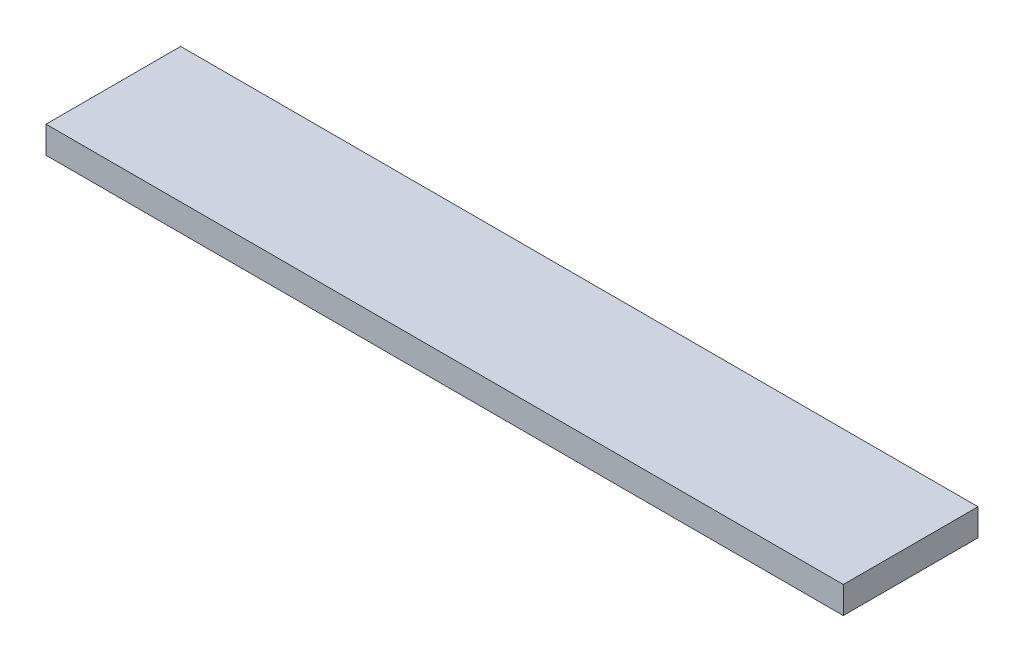
ISO-10303-21;
HEADER;
FILE_DESCRIPTION(('STEP AP214'),'2;1');
FILE_NAME('part.step','',(''),(''),'','','');
FILE_SCHEMA(('AUTOMOTIVE_DESIGN { 1 0 10303 214 1 1 1 1 }'));
ENDSEC;
DATA;
#1=APPLICATION_CONTEXT('core data for automotive mechanical design processes');
#2=APPLICATION_PROTOCOL_DEFINITION('international standard','automotive_design',2000,#1);
#3=PRODUCT_CONTEXT('',#1,'mechanical');
#4=PRODUCT('Part','Part','',(#3));
#5=PRODUCT_RELATED_PRODUCT_CATEGORY('part','',(#4));
#6=PRODUCT_DEFINITION_FORMATION('','',#4);
#7=PRODUCT_DEFINITION_CONTEXT('part definition',#1,'design');
#8=PRODUCT_DEFINITION('design','',#6,#7);
#9=PRODUCT_DEFINITION_SHAPE('','',#8);
#10=(LENGTH_UNIT() NAMED_UNIT(*) SI_UNIT(.MILLI.,.METRE.));
#11=(NAMED_UNIT(*) PLANE_ANGLE_UNIT() SI_UNIT($,.RADIAN.));
#12=(NAMED_UNIT(*) SI_UNIT($,.STERADIAN.) SOLID_ANGLE_UNIT());
#13=UNCERTAINTY_MEASURE_WITH_UNIT(LENGTH_MEASURE(1.E-05),#10,'distance_accuracy_value','');
#14=(GEOMETRIC_REPRESENTATION_CONTEXT(3) GLOBAL_UNCERTAINTY_ASSIGNED_CONTEXT((#13)) GLOBAL_UNIT_ASSIGNED_CONTEXT((#10,
#11,#12)) REPRESENTATION_CONTEXT('',''));
#15=CARTESIAN_POINT('',(0.,0.,0.));
#16=DIRECTION('',(0.,0.,1.));
#17=DIRECTION('',(1.,0.,0.));
#18=AXIS2_PLACEMENT_3D('',#15,#16,#17);
#19=CARTESIAN_POINT('',(148.,10.0000000000012,-25.));
#20=DIRECTION('',(-1.,0.,0.));
#21=DIRECTION('',(0.,0.,1.));
#22=AXIS2_PLACEMENT_3D('',#19,#20,#21);
#23=PLANE('',#22);
#24=DIRECTION('',(0.,0.,-1.));
#25=VECTOR('',#24,1.);
#26=CARTESIAN_POINT('',(148.,1.22124532708767E-12,-25.));
#27=LINE('',#26,#25);
#28=CARTESIAN_POINT('',(148.,1.22124532708767E-12,25.0000000000006));
#29=VERTEX_POINT('',#28);
#30=CARTESIAN_POINT('',(148.,1.22124532708767E-12,-25.));
#31=VERTEX_POINT('',#30);
#32=EDGE_CURVE('E93',#29,#31,#27,.T.);
#33=ORIENTED_EDGE('',*,*,#32,.T.);
#34=DIRECTION('',(0.,-1.,0.));
#35=VECTOR('',#34,1.);
#36=CARTESIAN_POINT('',(148.,10.0000000000012,-25.));
#37=LINE('',#36,#35);
#38=CARTESIAN_POINT('',(148.,10.0000000000012,-25.));
#39=VERTEX_POINT('',#38);
#40=EDGE_CURVE('E11',#39,#31,#37,.T.);
#41=ORIENTED_EDGE('',*,*,#40,.F.);
#42=DIRECTION('',(0.,0.,-1.));
#43=VECTOR('',#42,1.);
#44=CARTESIAN_POINT('',(148.,10.0000000000012,-25.));
#45=LINE('',#44,#43);
#46=CARTESIAN_POINT('',(148.,10.0000000000012,25.0000000000006));
#47=VERTEX_POINT('',#46);
#48=EDGE_CURVE('E81',#47,#39,#45,.T.);
#49=ORIENTED_EDGE('',*,*,#48,.F.);
#50=DIRECTION('',(0.,-1.,0.));
#51=VECTOR('',#50,1.);
#52=CARTESIAN_POINT('',(148.,10.0000000000012,25.0000000000006));
#53=LINE('',#52,#51);
#54=EDGE_CURVE('E89',#47,#29,#53,.T.);
#55=ORIENTED_EDGE('',*,*,#54,.T.);
#56=EDGE_LOOP('',(#33,#41,#49,#55));
#57=FACE_BOUND('',#56,.T.);
#58=ADVANCED_FACE('F30',(#57),#23,.F.);
#59=CARTESIAN_POINT('',(-148.,9.9999999999994,-25.));
#60=DIRECTION('',(0.,0.,1.));
#61=DIRECTION('',(1.,0.,0.));
#62=AXIS2_PLACEMENT_3D('',#59,#60,#61);
#63=PLANE('',#62);
#64=DIRECTION('',(-1.,0.,0.));
#65=VECTOR('',#64,1.);
#66=CARTESIAN_POINT('',(-148.,-6.10622663543836E-13,-25.));
#67=LINE('',#66,#65);
#68=CARTESIAN_POINT('',(-148.,-6.10622663543836E-13,-25.));
#69=VERTEX_POINT('',#68);
#70=EDGE_CURVE('E85',#31,#69,#67,.T.);
#71=ORIENTED_EDGE('',*,*,#70,.T.);
#72=DIRECTION('',(0.,-1.,0.));
#73=VECTOR('',#72,1.);
#74=CARTESIAN_POINT('',(-148.,9.9999999999994,-25.));
#75=LINE('',#74,#73);
#76=CARTESIAN_POINT('',(-148.,9.9999999999994,-25.));
#77=VERTEX_POINT('',#76);
#78=EDGE_CURVE('E38',#77,#69,#75,.T.);
#79=ORIENTED_EDGE('',*,*,#78,.F.);
#80=DIRECTION('',(-1.,0.,0.));
#81=VECTOR('',#80,1.);
#82=CARTESIAN_POINT('',(-148.,9.9999999999994,-25.));
#83=LINE('',#82,#81);
#84=EDGE_CURVE('E76',#39,#77,#83,.T.);
#85=ORIENTED_EDGE('',*,*,#84,.F.);
#86=ORIENTED_EDGE('',*,*,#40,.T.);
#87=EDGE_LOOP('',(#71,#79,#85,#86));
#88=FACE_BOUND('',#87,.T.);
#89=ADVANCED_FACE('F84',(#88),#63,.F.);
#90=CARTESIAN_POINT('',(-148.,9.9999999999994,-25.));
#91=DIRECTION('',(1.,0.,0.));
#92=DIRECTION('',(0.,0.,-1.));
#93=AXIS2_PLACEMENT_3D('',#90,#91,#92);
#94=PLANE('',#93);
#95=DIRECTION('',(0.,0.,1.));
#96=VECTOR('',#95,1.);
#97=CARTESIAN_POINT('',(-148.,-6.10622663543836E-13,-25.));
#98=LINE('',#97,#96);
#99=CARTESIAN_POINT('',(-148.,-6.10622663543836E-13,25.0000000000003));
#100=VERTEX_POINT('',#99);
#101=EDGE_CURVE('E63',#69,#100,#98,.T.);
#102=ORIENTED_EDGE('',*,*,#101,.T.);
#103=DIRECTION('',(0.,-1.,0.));
#104=VECTOR('',#103,1.);
#105=CARTESIAN_POINT('',(-148.,9.9999999999994,25.0000000000003));
#106=LINE('',#105,#104);
#107=CARTESIAN_POINT('',(-148.,9.9999999999994,25.0000000000003));
#108=VERTEX_POINT('',#107);
#109=EDGE_CURVE('E86',#108,#100,#106,.T.);
#110=ORIENTED_EDGE('',*,*,#109,.F.);
#111=DIRECTION('',(0.,0.,1.));
#112=VECTOR('',#111,1.);
#113=CARTESIAN_POINT('',(-148.,9.9999999999994,-25.));
#114=LINE('',#113,#112);
#115=EDGE_CURVE('E79',#77,#108,#114,.T.);
#116=ORIENTED_EDGE('',*,*,#115,.F.);
#117=ORIENTED_EDGE('',*,*,#78,.T.);
#118=EDGE_LOOP('',(#102,#110,#116,#117));
#119=FACE_BOUND('',#118,.T.);
#120=ADVANCED_FACE('F87',(#119),#94,.F.);
#121=CARTESIAN_POINT('',(-148.,9.9999999999994,25.0000000000003));
#122=DIRECTION('',(0.,0.,-1.));
#123=DIRECTION('',(-1.,0.,0.));
#124=AXIS2_PLACEMENT_3D('',#121,#122,#123);
#125=PLANE('',#124);
#126=DIRECTION('',(1.,0.,0.));
#127=VECTOR('',#126,1.);
#128=CARTESIAN_POINT('',(-148.,-6.10622663543836E-13,25.0000000000003));
#129=LINE('',#128,#127);
#130=EDGE_CURVE('E69',#100,#29,#129,.T.);
#131=ORIENTED_EDGE('',*,*,#130,.T.);
#132=ORIENTED_EDGE('',*,*,#54,.F.);
#133=DIRECTION('',(1.,0.,0.));
#134=VECTOR('',#133,1.);
#135=CARTESIAN_POINT('',(-148.,9.9999999999994,25.0000000000003));
#136=LINE('',#135,#134);
#137=EDGE_CURVE('E46',#108,#47,#136,.T.);
#138=ORIENTED_EDGE('',*,*,#137,.F.);
#139=ORIENTED_EDGE('',*,*,#109,.T.);
#140=EDGE_LOOP('',(#131,#132,#138,#139));
#141=FACE_BOUND('',#140,.T.);
#142=ADVANCED_FACE('F100',(#141),#125,.F.);
#143=CARTESIAN_POINT('',(0.,10.,0.));
#144=DIRECTION('',(0.,1.,0.));
#145=DIRECTION('',(0.,0.,1.));
#146=AXIS2_PLACEMENT_3D('',#143,#144,#145);
#147=PLANE('',#146);
#148=ORIENTED_EDGE('',*,*,#48,.T.);
#149=ORIENTED_EDGE('',*,*,#84,.T.);
#150=ORIENTED_EDGE('',*,*,#115,.T.);
#151=ORIENTED_EDGE('',*,*,#137,.T.);
#152=EDGE_LOOP('',(#148,#149,#150,#151));
#153=FACE_BOUND('',#152,.T.);
#154=ADVANCED_FACE('F77',(#153),#147,.T.);
#155=CARTESIAN_POINT('',(0.,0.,0.));
#156=DIRECTION('',(0.,1.,0.));
#157=DIRECTION('',(0.,0.,1.));
#158=AXIS2_PLACEMENT_3D('',#155,#156,#157);
#159=PLANE('',#158);
#160=ORIENTED_EDGE('',*,*,#32,.F.);
#161=ORIENTED_EDGE('',*,*,#130,.F.);
#162=ORIENTED_EDGE('',*,*,#101,.F.);
#163=ORIENTED_EDGE('',*,*,#70,.F.);
#164=EDGE_LOOP('',(#160,#161,#162,#163));
#165=FACE_BOUND('',#164,.T.);
#166=ADVANCED_FACE('F103',(#165),#159,.F.);
#167=CLOSED_SHELL('',(#58,#89,#120,#142,#154,#166));
#168=MANIFOLD_SOLID_BREP('B2',#167);
#169=ADVANCED_BREP_SHAPE_REPRESENTATION('',(#18,#168),#14);
#170=SHAPE_DEFINITION_REPRESENTATION(#9,#169);
ENDSEC;
END-ISO-10303-21;
